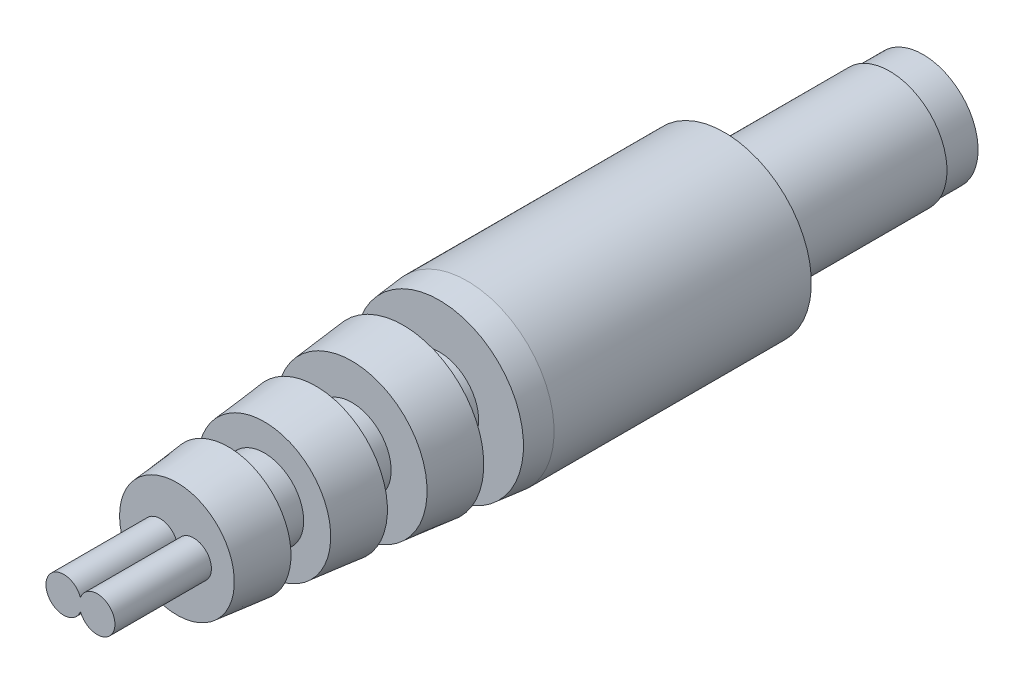
ISO-10303-21;
HEADER;
FILE_DESCRIPTION(('STEP AP214'),'2;1');
FILE_NAME('part.step','',(''),(''),'','','');
FILE_SCHEMA(('AUTOMOTIVE_DESIGN { 1 0 10303 214 1 1 1 1 }'));
ENDSEC;
DATA;
#1=APPLICATION_CONTEXT('core data for automotive mechanical design processes');
#2=APPLICATION_PROTOCOL_DEFINITION('international standard','automotive_design',2000,#1);
#3=PRODUCT_CONTEXT('',#1,'mechanical');
#4=PRODUCT('Part','Part','',(#3));
#5=PRODUCT_RELATED_PRODUCT_CATEGORY('part','',(#4));
#6=PRODUCT_DEFINITION_FORMATION('','',#4);
#7=PRODUCT_DEFINITION_CONTEXT('part definition',#1,'design');
#8=PRODUCT_DEFINITION('design','',#6,#7);
#9=PRODUCT_DEFINITION_SHAPE('','',#8);
#10=(LENGTH_UNIT() NAMED_UNIT(*) SI_UNIT(.MILLI.,.METRE.));
#11=(NAMED_UNIT(*) PLANE_ANGLE_UNIT() SI_UNIT($,.RADIAN.));
#12=(NAMED_UNIT(*) SI_UNIT($,.STERADIAN.) SOLID_ANGLE_UNIT());
#13=UNCERTAINTY_MEASURE_WITH_UNIT(LENGTH_MEASURE(1.E-05),#10,'distance_accuracy_value','');
#14=(GEOMETRIC_REPRESENTATION_CONTEXT(3) GLOBAL_UNCERTAINTY_ASSIGNED_CONTEXT((#13)) GLOBAL_UNIT_ASSIGNED_CONTEXT((#10,
#11,#12)) REPRESENTATION_CONTEXT('',''));
#15=CARTESIAN_POINT('',(0.,0.,0.));
#16=DIRECTION('',(0.,0.,1.));
#17=DIRECTION('',(1.,0.,0.));
#18=AXIS2_PLACEMENT_3D('',#15,#16,#17);
#19=CARTESIAN_POINT('',(0.,0.,36.83));
#20=DIRECTION('',(0.,0.,1.));
#21=DIRECTION('',(1.,0.,0.));
#22=AXIS2_PLACEMENT_3D('',#19,#20,#21);
#23=PLANE('',#22);
#24=CARTESIAN_POINT('',(0.,0.,36.83));
#25=DIRECTION('',(0.,0.,-1.));
#26=DIRECTION('',(-1.,0.,0.));
#27=AXIS2_PLACEMENT_3D('',#24,#25,#26);
#28=CIRCLE('',#27,2.8321);
#29=CARTESIAN_POINT('',(-2.8321,0.,36.83));
#30=VERTEX_POINT('',#29);
#31=EDGE_CURVE('E11',#30,#30,#28,.T.);
#32=ORIENTED_EDGE('',*,*,#31,.F.);
#33=EDGE_LOOP('',(#32));
#34=FACE_BOUND('',#33,.T.);
#35=CARTESIAN_POINT('',(0.826236930167257,0.,36.83));
#36=DIRECTION('',(0.,0.,1.));
#37=DIRECTION('',(1.,0.,0.));
#38=AXIS2_PLACEMENT_3D('',#35,#36,#37);
#39=CIRCLE('',#38,0.8763);
#40=CARTESIAN_POINT('',(0.,-0.291949011349221,36.83));
#41=VERTEX_POINT('',#40);
#42=CARTESIAN_POINT('',(0.,0.291949011349221,36.83));
#43=VERTEX_POINT('',#42);
#44=EDGE_CURVE('E62',#41,#43,#39,.T.);
#45=ORIENTED_EDGE('',*,*,#44,.F.);
#46=CARTESIAN_POINT('',(-0.826236930167257,0.,36.83));
#47=DIRECTION('',(0.,0.,1.));
#48=DIRECTION('',(-1.,0.,0.));
#49=AXIS2_PLACEMENT_3D('',#46,#47,#48);
#50=CIRCLE('',#49,0.8763);
#51=EDGE_CURVE('E47',#43,#41,#50,.T.);
#52=ORIENTED_EDGE('',*,*,#51,.F.);
#53=EDGE_LOOP('',(#45,#52));
#54=FACE_BOUND('',#53,.T.);
#55=ADVANCED_FACE('F33',(#34,#54),#23,.T.);
#56=CARTESIAN_POINT('',(0.,0.,34.29));
#57=DIRECTION('',(0.,0.,-1.));
#58=DIRECTION('',(-1.,0.,0.));
#59=AXIS2_PLACEMENT_3D('',#56,#57,#58);
#60=CONICAL_SURFACE('',#59,3.09105390070922,0.101599321439396);
#61=ORIENTED_EDGE('',*,*,#31,.T.);
#62=EDGE_LOOP('',(#61));
#63=FACE_BOUND('',#62,.T.);
#64=CARTESIAN_POINT('',(0.,0.,34.29));
#65=DIRECTION('',(0.,0.,-1.));
#66=DIRECTION('',(-1.,0.,0.));
#67=AXIS2_PLACEMENT_3D('',#64,#65,#66);
#68=CIRCLE('',#67,3.09105390070922);
#69=CARTESIAN_POINT('',(-3.09105390070922,0.,34.29));
#70=VERTEX_POINT('',#69);
#71=EDGE_CURVE('E40',#70,#70,#68,.T.);
#72=ORIENTED_EDGE('',*,*,#71,.F.);
#73=EDGE_LOOP('',(#72));
#74=FACE_BOUND('',#73,.T.);
#75=ADVANCED_FACE('F139',(#63,#74),#60,.T.);
#76=CARTESIAN_POINT('',(0.,3.09105390070922,34.29));
#77=DIRECTION('',(0.,0.,-1.));
#78=DIRECTION('',(-1.,0.,0.));
#79=AXIS2_PLACEMENT_3D('',#76,#77,#78);
#80=PLANE('',#79);
#81=ORIENTED_EDGE('',*,*,#71,.T.);
#82=EDGE_LOOP('',(#81));
#83=FACE_BOUND('',#82,.T.);
#84=CARTESIAN_POINT('',(0.,0.,34.29));
#85=DIRECTION('',(0.,0.,-1.));
#86=DIRECTION('',(-1.,0.,0.));
#87=AXIS2_PLACEMENT_3D('',#84,#85,#86);
#88=CIRCLE('',#87,1.93888495482852);
#89=CARTESIAN_POINT('',(-1.93888495482852,0.,34.29));
#90=VERTEX_POINT('',#89);
#91=EDGE_CURVE('E131',#90,#90,#88,.T.);
#92=ORIENTED_EDGE('',*,*,#91,.F.);
#93=EDGE_LOOP('',(#92));
#94=FACE_BOUND('',#93,.T.);
#95=ADVANCED_FACE('F136',(#83,#94),#80,.T.);
#96=CARTESIAN_POINT('',(0.,0.,0.));
#97=DIRECTION('',(0.,0.,-1.));
#98=DIRECTION('',(-1.,0.,0.));
#99=AXIS2_PLACEMENT_3D('',#96,#97,#98);
#100=CYLINDRICAL_SURFACE('',#99,1.93888495482852);
#101=ORIENTED_EDGE('',*,*,#91,.T.);
#102=EDGE_LOOP('',(#101));
#103=FACE_BOUND('',#102,.T.);
#104=CARTESIAN_POINT('',(0.,0.,32.512));
#105=DIRECTION('',(0.,0.,-1.));
#106=DIRECTION('',(-1.,0.,0.));
#107=AXIS2_PLACEMENT_3D('',#104,#105,#106);
#108=CIRCLE('',#107,1.93888495482852);
#109=CARTESIAN_POINT('',(-1.93888495482852,0.,32.512));
#110=VERTEX_POINT('',#109);
#111=EDGE_CURVE('E128',#110,#110,#108,.T.);
#112=ORIENTED_EDGE('',*,*,#111,.F.);
#113=EDGE_LOOP('',(#112));
#114=FACE_BOUND('',#113,.T.);
#115=ADVANCED_FACE('F146',(#103,#114),#100,.T.);
#116=CARTESIAN_POINT('',(0.,1.93888495482852,32.512));
#117=DIRECTION('',(0.,0.,1.));
#118=DIRECTION('',(1.,0.,0.));
#119=AXIS2_PLACEMENT_3D('',#116,#117,#118);
#120=PLANE('',#119);
#121=ORIENTED_EDGE('',*,*,#111,.T.);
#122=EDGE_LOOP('',(#121));
#123=FACE_BOUND('',#122,.T.);
#124=CARTESIAN_POINT('',(0.,0.,32.512));
#125=DIRECTION('',(0.,0.,-1.));
#126=DIRECTION('',(-1.,0.,0.));
#127=AXIS2_PLACEMENT_3D('',#124,#125,#126);
#128=CIRCLE('',#127,3.27232163120567);
#129=CARTESIAN_POINT('',(-3.27232163120567,0.,32.512));
#130=VERTEX_POINT('',#129);
#131=EDGE_CURVE('E125',#130,#130,#128,.T.);
#132=ORIENTED_EDGE('',*,*,#131,.F.);
#133=EDGE_LOOP('',(#132));
#134=FACE_BOUND('',#133,.T.);
#135=ADVANCED_FACE('F152',(#123,#134),#120,.T.);
#136=CARTESIAN_POINT('',(0.,0.,29.972));
#137=DIRECTION('',(0.,0.,-1.));
#138=DIRECTION('',(-1.,0.,0.));
#139=AXIS2_PLACEMENT_3D('',#136,#137,#138);
#140=CONICAL_SURFACE('',#139,3.53127553191489,0.101599321439396);
#141=ORIENTED_EDGE('',*,*,#131,.T.);
#142=EDGE_LOOP('',(#141));
#143=FACE_BOUND('',#142,.T.);
#144=CARTESIAN_POINT('',(0.,0.,29.972));
#145=DIRECTION('',(0.,0.,-1.));
#146=DIRECTION('',(-1.,0.,0.));
#147=AXIS2_PLACEMENT_3D('',#144,#145,#146);
#148=CIRCLE('',#147,3.53127553191489);
#149=CARTESIAN_POINT('',(-3.53127553191489,0.,29.972));
#150=VERTEX_POINT('',#149);
#151=EDGE_CURVE('E122',#150,#150,#148,.T.);
#152=ORIENTED_EDGE('',*,*,#151,.F.);
#153=EDGE_LOOP('',(#152));
#154=FACE_BOUND('',#153,.T.);
#155=ADVANCED_FACE('F156',(#143,#154),#140,.T.);
#156=CARTESIAN_POINT('',(0.,3.53127553191489,29.972));
#157=DIRECTION('',(0.,0.,-1.));
#158=DIRECTION('',(-1.,0.,0.));
#159=AXIS2_PLACEMENT_3D('',#156,#157,#158);
#160=PLANE('',#159);
#161=ORIENTED_EDGE('',*,*,#151,.T.);
#162=EDGE_LOOP('',(#161));
#163=FACE_BOUND('',#162,.T.);
#164=CARTESIAN_POINT('',(0.,0.,29.972));
#165=DIRECTION('',(0.,0.,-1.));
#166=DIRECTION('',(-1.,0.,0.));
#167=AXIS2_PLACEMENT_3D('',#164,#165,#166);
#168=CIRCLE('',#167,1.93888495482852);
#169=CARTESIAN_POINT('',(-1.93888495482852,0.,29.972));
#170=VERTEX_POINT('',#169);
#171=EDGE_CURVE('E119',#170,#170,#168,.T.);
#172=ORIENTED_EDGE('',*,*,#171,.F.);
#173=EDGE_LOOP('',(#172));
#174=FACE_BOUND('',#173,.T.);
#175=ADVANCED_FACE('F160',(#163,#174),#160,.T.);
#176=CARTESIAN_POINT('',(0.,0.,0.));
#177=DIRECTION('',(0.,0.,-1.));
#178=DIRECTION('',(-1.,0.,0.));
#179=AXIS2_PLACEMENT_3D('',#176,#177,#178);
#180=CYLINDRICAL_SURFACE('',#179,1.93888495482852);
#181=ORIENTED_EDGE('',*,*,#171,.T.);
#182=EDGE_LOOP('',(#181));
#183=FACE_BOUND('',#182,.T.);
#184=CARTESIAN_POINT('',(0.,0.,28.194));
#185=DIRECTION('',(0.,0.,-1.));
#186=DIRECTION('',(-1.,0.,0.));
#187=AXIS2_PLACEMENT_3D('',#184,#185,#186);
#188=CIRCLE('',#187,1.93888495482852);
#189=CARTESIAN_POINT('',(-1.93888495482852,0.,28.194));
#190=VERTEX_POINT('',#189);
#191=EDGE_CURVE('E116',#190,#190,#188,.T.);
#192=ORIENTED_EDGE('',*,*,#191,.F.);
#193=EDGE_LOOP('',(#192));
#194=FACE_BOUND('',#193,.T.);
#195=ADVANCED_FACE('F164',(#183,#194),#180,.T.);
#196=CARTESIAN_POINT('',(0.,1.93888495482852,28.194));
#197=DIRECTION('',(0.,0.,1.));
#198=DIRECTION('',(1.,0.,0.));
#199=AXIS2_PLACEMENT_3D('',#196,#197,#198);
#200=PLANE('',#199);
#201=ORIENTED_EDGE('',*,*,#191,.T.);
#202=EDGE_LOOP('',(#201));
#203=FACE_BOUND('',#202,.T.);
#204=CARTESIAN_POINT('',(0.,0.,28.194));
#205=DIRECTION('',(0.,0.,-1.));
#206=DIRECTION('',(-1.,0.,0.));
#207=AXIS2_PLACEMENT_3D('',#204,#205,#206);
#208=CIRCLE('',#207,3.71254326241135);
#209=CARTESIAN_POINT('',(-3.71254326241135,0.,28.194));
#210=VERTEX_POINT('',#209);
#211=EDGE_CURVE('E113',#210,#210,#208,.T.);
#212=ORIENTED_EDGE('',*,*,#211,.F.);
#213=EDGE_LOOP('',(#212));
#214=FACE_BOUND('',#213,.T.);
#215=ADVANCED_FACE('F168',(#203,#214),#200,.T.);
#216=CARTESIAN_POINT('',(0.,0.,25.654));
#217=DIRECTION('',(0.,0.,-1.));
#218=DIRECTION('',(-1.,0.,0.));
#219=AXIS2_PLACEMENT_3D('',#216,#217,#218);
#220=CONICAL_SURFACE('',#219,3.97149716312057,0.101599321439396);
#221=ORIENTED_EDGE('',*,*,#211,.T.);
#222=EDGE_LOOP('',(#221));
#223=FACE_BOUND('',#222,.T.);
#224=CARTESIAN_POINT('',(0.,0.,25.654));
#225=DIRECTION('',(0.,0.,-1.));
#226=DIRECTION('',(-1.,0.,0.));
#227=AXIS2_PLACEMENT_3D('',#224,#225,#226);
#228=CIRCLE('',#227,3.97149716312057);
#229=CARTESIAN_POINT('',(-3.97149716312057,0.,25.654));
#230=VERTEX_POINT('',#229);
#231=EDGE_CURVE('E110',#230,#230,#228,.T.);
#232=ORIENTED_EDGE('',*,*,#231,.F.);
#233=EDGE_LOOP('',(#232));
#234=FACE_BOUND('',#233,.T.);
#235=ADVANCED_FACE('F172',(#223,#234),#220,.T.);
#236=CARTESIAN_POINT('',(0.,3.97149716312057,25.654));
#237=DIRECTION('',(0.,0.,-1.));
#238=DIRECTION('',(-1.,0.,0.));
#239=AXIS2_PLACEMENT_3D('',#236,#237,#238);
#240=PLANE('',#239);
#241=ORIENTED_EDGE('',*,*,#231,.T.);
#242=EDGE_LOOP('',(#241));
#243=FACE_BOUND('',#242,.T.);
#244=CARTESIAN_POINT('',(0.,0.,25.654));
#245=DIRECTION('',(0.,0.,-1.));
#246=DIRECTION('',(-1.,0.,0.));
#247=AXIS2_PLACEMENT_3D('',#244,#245,#246);
#248=CIRCLE('',#247,1.93888495482852);
#249=CARTESIAN_POINT('',(-1.93888495482852,0.,25.654));
#250=VERTEX_POINT('',#249);
#251=EDGE_CURVE('E107',#250,#250,#248,.T.);
#252=ORIENTED_EDGE('',*,*,#251,.F.);
#253=EDGE_LOOP('',(#252));
#254=FACE_BOUND('',#253,.T.);
#255=ADVANCED_FACE('F176',(#243,#254),#240,.T.);
#256=CARTESIAN_POINT('',(0.,0.,0.));
#257=DIRECTION('',(0.,0.,-1.));
#258=DIRECTION('',(-1.,0.,0.));
#259=AXIS2_PLACEMENT_3D('',#256,#257,#258);
#260=CYLINDRICAL_SURFACE('',#259,1.93888495482852);
#261=ORIENTED_EDGE('',*,*,#251,.T.);
#262=EDGE_LOOP('',(#261));
#263=FACE_BOUND('',#262,.T.);
#264=CARTESIAN_POINT('',(0.,0.,23.876));
#265=DIRECTION('',(0.,0.,-1.));
#266=DIRECTION('',(-1.,0.,0.));
#267=AXIS2_PLACEMENT_3D('',#264,#265,#266);
#268=CIRCLE('',#267,1.93888495482852);
#269=CARTESIAN_POINT('',(-1.93888495482852,0.,23.876));
#270=VERTEX_POINT('',#269);
#271=EDGE_CURVE('E104',#270,#270,#268,.T.);
#272=ORIENTED_EDGE('',*,*,#271,.F.);
#273=EDGE_LOOP('',(#272));
#274=FACE_BOUND('',#273,.T.);
#275=ADVANCED_FACE('F180',(#263,#274),#260,.T.);
#276=CARTESIAN_POINT('',(0.,1.93888495482852,23.876));
#277=DIRECTION('',(0.,0.,1.));
#278=DIRECTION('',(1.,0.,0.));
#279=AXIS2_PLACEMENT_3D('',#276,#277,#278);
#280=PLANE('',#279);
#281=ORIENTED_EDGE('',*,*,#271,.T.);
#282=EDGE_LOOP('',(#281));
#283=FACE_BOUND('',#282,.T.);
#284=CARTESIAN_POINT('',(0.,0.,23.876));
#285=DIRECTION('',(0.,0.,-1.));
#286=DIRECTION('',(-1.,0.,0.));
#287=AXIS2_PLACEMENT_3D('',#284,#285,#286);
#288=CIRCLE('',#287,4.15276489361702);
#289=CARTESIAN_POINT('',(-4.15276489361702,0.,23.876));
#290=VERTEX_POINT('',#289);
#291=EDGE_CURVE('E101',#290,#290,#288,.T.);
#292=ORIENTED_EDGE('',*,*,#291,.F.);
#293=EDGE_LOOP('',(#292));
#294=FACE_BOUND('',#293,.T.);
#295=ADVANCED_FACE('F184',(#283,#294),#280,.T.);
#296=CARTESIAN_POINT('',(0.,0.,22.5044));
#297=DIRECTION('',(0.,0.,-1.));
#298=DIRECTION('',(-1.,0.,0.));
#299=AXIS2_PLACEMENT_3D('',#296,#297,#298);
#300=CONICAL_SURFACE('',#299,4.2926,0.101599321439396);
#301=ORIENTED_EDGE('',*,*,#291,.T.);
#302=EDGE_LOOP('',(#301));
#303=FACE_BOUND('',#302,.T.);
#304=CARTESIAN_POINT('',(0.,0.,22.5044));
#305=DIRECTION('',(0.,0.,-1.));
#306=DIRECTION('',(-1.,0.,0.));
#307=AXIS2_PLACEMENT_3D('',#304,#305,#306);
#308=CIRCLE('',#307,4.2926);
#309=CARTESIAN_POINT('',(-4.2926,0.,22.5044));
#310=VERTEX_POINT('',#309);
#311=EDGE_CURVE('E98',#310,#310,#308,.T.);
#312=ORIENTED_EDGE('',*,*,#311,.F.);
#313=EDGE_LOOP('',(#312));
#314=FACE_BOUND('',#313,.T.);
#315=ADVANCED_FACE('F188',(#303,#314),#300,.T.);
#316=CARTESIAN_POINT('',(0.,0.,0.));
#317=DIRECTION('',(0.,0.,-1.));
#318=DIRECTION('',(-1.,0.,0.));
#319=AXIS2_PLACEMENT_3D('',#316,#317,#318);
#320=CYLINDRICAL_SURFACE('',#319,4.2926);
#321=ORIENTED_EDGE('',*,*,#311,.T.);
#322=EDGE_LOOP('',(#321));
#323=FACE_BOUND('',#322,.T.);
#324=CARTESIAN_POINT('',(0.,0.,9.8044));
#325=DIRECTION('',(0.,0.,-1.));
#326=DIRECTION('',(-1.,0.,0.));
#327=AXIS2_PLACEMENT_3D('',#324,#325,#326);
#328=CIRCLE('',#327,4.2926);
#329=CARTESIAN_POINT('',(-4.2926,0.,9.8044));
#330=VERTEX_POINT('',#329);
#331=EDGE_CURVE('E95',#330,#330,#328,.T.);
#332=ORIENTED_EDGE('',*,*,#331,.F.);
#333=EDGE_LOOP('',(#332));
#334=FACE_BOUND('',#333,.T.);
#335=ADVANCED_FACE('F192',(#323,#334),#320,.T.);
#336=CARTESIAN_POINT('',(0.,2.8321,9.8044));
#337=DIRECTION('',(0.,0.,-1.));
#338=DIRECTION('',(-1.,0.,0.));
#339=AXIS2_PLACEMENT_3D('',#336,#337,#338);
#340=PLANE('',#339);
#341=ORIENTED_EDGE('',*,*,#331,.T.);
#342=EDGE_LOOP('',(#341));
#343=FACE_BOUND('',#342,.T.);
#344=CARTESIAN_POINT('',(0.,0.,9.8044));
#345=DIRECTION('',(0.,0.,-1.));
#346=DIRECTION('',(-1.,0.,0.));
#347=AXIS2_PLACEMENT_3D('',#344,#345,#346);
#348=CIRCLE('',#347,2.8321);
#349=CARTESIAN_POINT('',(-2.8321,0.,9.8044));
#350=VERTEX_POINT('',#349);
#351=EDGE_CURVE('E92',#350,#350,#348,.T.);
#352=ORIENTED_EDGE('',*,*,#351,.F.);
#353=EDGE_LOOP('',(#352));
#354=FACE_BOUND('',#353,.T.);
#355=ADVANCED_FACE('F196',(#343,#354),#340,.T.);
#356=CARTESIAN_POINT('',(0.,0.,0.));
#357=DIRECTION('',(0.,0.,-1.));
#358=DIRECTION('',(-1.,0.,0.));
#359=AXIS2_PLACEMENT_3D('',#356,#357,#358);
#360=CYLINDRICAL_SURFACE('',#359,2.8321);
#361=ORIENTED_EDGE('',*,*,#351,.T.);
#362=EDGE_LOOP('',(#361));
#363=FACE_BOUND('',#362,.T.);
#364=CARTESIAN_POINT('',(0.,0.,1.651));
#365=DIRECTION('',(0.,0.,-1.));
#366=DIRECTION('',(-1.,0.,0.));
#367=AXIS2_PLACEMENT_3D('',#364,#365,#366);
#368=CIRCLE('',#367,2.8321);
#369=CARTESIAN_POINT('',(-2.8321,0.,1.651));
#370=VERTEX_POINT('',#369);
#371=EDGE_CURVE('E89',#370,#370,#368,.T.);
#372=ORIENTED_EDGE('',*,*,#371,.F.);
#373=EDGE_LOOP('',(#372));
#374=FACE_BOUND('',#373,.T.);
#375=ADVANCED_FACE('F200',(#363,#374),#360,.T.);
#376=CARTESIAN_POINT('',(0.,2.8321,1.651));
#377=DIRECTION('',(0.,0.,-1.));
#378=DIRECTION('',(-1.,0.,0.));
#379=AXIS2_PLACEMENT_3D('',#376,#377,#378);
#380=PLANE('',#379);
#381=ORIENTED_EDGE('',*,*,#371,.T.);
#382=EDGE_LOOP('',(#381));
#383=FACE_BOUND('',#382,.T.);
#384=CARTESIAN_POINT('',(0.,0.,1.651));
#385=DIRECTION('',(0.,0.,-1.));
#386=DIRECTION('',(-1.,0.,0.));
#387=AXIS2_PLACEMENT_3D('',#384,#385,#386);
#388=CIRCLE('',#387,2.7178);
#389=CARTESIAN_POINT('',(-2.7178,0.,1.651));
#390=VERTEX_POINT('',#389);
#391=EDGE_CURVE('E86',#390,#390,#388,.T.);
#392=ORIENTED_EDGE('',*,*,#391,.F.);
#393=EDGE_LOOP('',(#392));
#394=FACE_BOUND('',#393,.T.);
#395=ADVANCED_FACE('F204',(#383,#394),#380,.T.);
#396=CARTESIAN_POINT('',(0.,0.,0.));
#397=DIRECTION('',(0.,0.,-1.));
#398=DIRECTION('',(-1.,0.,0.));
#399=AXIS2_PLACEMENT_3D('',#396,#397,#398);
#400=CYLINDRICAL_SURFACE('',#399,2.7178);
#401=ORIENTED_EDGE('',*,*,#391,.T.);
#402=EDGE_LOOP('',(#401));
#403=FACE_BOUND('',#402,.T.);
#404=CARTESIAN_POINT('',(0.,0.,0.));
#405=DIRECTION('',(0.,0.,-1.));
#406=DIRECTION('',(-1.,0.,0.));
#407=AXIS2_PLACEMENT_3D('',#404,#405,#406);
#408=CIRCLE('',#407,2.7178);
#409=CARTESIAN_POINT('',(-2.7178,0.,0.));
#410=VERTEX_POINT('',#409);
#411=EDGE_CURVE('E81',#410,#410,#408,.T.);
#412=ORIENTED_EDGE('',*,*,#411,.F.);
#413=EDGE_LOOP('',(#412));
#414=FACE_BOUND('',#413,.T.);
#415=ADVANCED_FACE('F208',(#403,#414),#400,.T.);
#416=CARTESIAN_POINT('',(0.,0.,0.));
#417=DIRECTION('',(0.,0.,-1.));
#418=DIRECTION('',(-1.,0.,0.));
#419=AXIS2_PLACEMENT_3D('',#416,#417,#418);
#420=PLANE('',#419);
#421=CARTESIAN_POINT('',(0.,0.,0.));
#422=DIRECTION('',(0.,0.,-1.));
#423=DIRECTION('',(-1.,0.,0.));
#424=AXIS2_PLACEMENT_3D('',#421,#422,#423);
#425=CIRCLE('',#424,1.1049);
#426=CARTESIAN_POINT('',(-1.1049,0.,0.));
#427=VERTEX_POINT('',#426);
#428=EDGE_CURVE('E77',#427,#427,#425,.T.);
#429=ORIENTED_EDGE('',*,*,#428,.F.);
#430=EDGE_LOOP('',(#429));
#431=FACE_BOUND('',#430,.T.);
#432=ORIENTED_EDGE('',*,*,#411,.T.);
#433=EDGE_LOOP('',(#432));
#434=FACE_BOUND('',#433,.T.);
#435=ADVANCED_FACE('F212',(#431,#434),#420,.T.);
#436=CARTESIAN_POINT('',(0.,0.,10.16));
#437=DIRECTION('',(0.,0.,-1.));
#438=DIRECTION('',(-1.,0.,0.));
#439=AXIS2_PLACEMENT_3D('',#436,#437,#438);
#440=CYLINDRICAL_SURFACE('',#439,1.1049);
#441=CARTESIAN_POINT('',(0.,0.,10.16));
#442=DIRECTION('',(0.,0.,-1.));
#443=DIRECTION('',(-1.,0.,0.));
#444=AXIS2_PLACEMENT_3D('',#441,#442,#443);
#445=CIRCLE('',#444,1.1049);
#446=CARTESIAN_POINT('',(-1.1049,0.,10.16));
#447=VERTEX_POINT('',#446);
#448=EDGE_CURVE('E78',#447,#447,#445,.T.);
#449=ORIENTED_EDGE('',*,*,#448,.F.);
#450=EDGE_LOOP('',(#449));
#451=FACE_BOUND('',#450,.T.);
#452=ORIENTED_EDGE('',*,*,#428,.T.);
#453=EDGE_LOOP('',(#452));
#454=FACE_BOUND('',#453,.T.);
#455=ADVANCED_FACE('F216',(#451,#454),#440,.F.);
#456=CARTESIAN_POINT('',(0.,0.,10.16));
#457=DIRECTION('',(0.,0.,-1.));
#458=DIRECTION('',(-1.,0.,0.));
#459=AXIS2_PLACEMENT_3D('',#456,#457,#458);
#460=PLANE('',#459);
#461=ORIENTED_EDGE('',*,*,#448,.T.);
#462=EDGE_LOOP('',(#461));
#463=FACE_BOUND('',#462,.T.);
#464=ADVANCED_FACE('F220',(#463),#460,.T.);
#465=CARTESIAN_POINT('',(-0.826236930167257,0.,41.5925));
#466=DIRECTION('',(0.,0.,-1.));
#467=DIRECTION('',(-1.,0.,0.));
#468=AXIS2_PLACEMENT_3D('',#465,#466,#467);
#469=CYLINDRICAL_SURFACE('',#468,0.8763);
#470=ORIENTED_EDGE('',*,*,#51,.T.);
#471=DIRECTION('',(0.,0.,-1.));
#472=VECTOR('',#471,1.);
#473=CARTESIAN_POINT('',(0.,-0.291949011349221,41.5925));
#474=LINE('',#473,#472);
#475=CARTESIAN_POINT('',(0.,-0.291949011349221,41.5925));
#476=VERTEX_POINT('',#475);
#477=EDGE_CURVE('E66',#476,#41,#474,.T.);
#478=ORIENTED_EDGE('',*,*,#477,.F.);
#479=CARTESIAN_POINT('',(-0.826236930167257,0.,41.5925));
#480=DIRECTION('',(0.,0.,1.));
#481=DIRECTION('',(-1.,0.,0.));
#482=AXIS2_PLACEMENT_3D('',#479,#480,#481);
#483=CIRCLE('',#482,0.8763);
#484=CARTESIAN_POINT('',(0.,0.291949011349221,41.5925));
#485=VERTEX_POINT('',#484);
#486=EDGE_CURVE('E68',#485,#476,#483,.T.);
#487=ORIENTED_EDGE('',*,*,#486,.F.);
#488=DIRECTION('',(0.,0.,-1.));
#489=VECTOR('',#488,1.);
#490=CARTESIAN_POINT('',(0.,0.291949011349221,41.5925));
#491=LINE('',#490,#489);
#492=EDGE_CURVE('E64',#485,#43,#491,.T.);
#493=ORIENTED_EDGE('',*,*,#492,.T.);
#494=EDGE_LOOP('',(#470,#478,#487,#493));
#495=FACE_BOUND('',#494,.T.);
#496=ADVANCED_FACE('F70',(#495),#469,.T.);
#497=CARTESIAN_POINT('',(0.826236930167257,0.,41.5925));
#498=DIRECTION('',(0.,0.,-1.));
#499=DIRECTION('',(-1.,0.,0.));
#500=AXIS2_PLACEMENT_3D('',#497,#498,#499);
#501=CYLINDRICAL_SURFACE('',#500,0.8763);
#502=ORIENTED_EDGE('',*,*,#44,.T.);
#503=ORIENTED_EDGE('',*,*,#492,.F.);
#504=CARTESIAN_POINT('',(0.826236930167257,0.,41.5925));
#505=DIRECTION('',(0.,0.,1.));
#506=DIRECTION('',(1.,0.,0.));
#507=AXIS2_PLACEMENT_3D('',#504,#505,#506);
#508=CIRCLE('',#507,0.8763);
#509=EDGE_CURVE('E55',#476,#485,#508,.T.);
#510=ORIENTED_EDGE('',*,*,#509,.F.);
#511=ORIENTED_EDGE('',*,*,#477,.T.);
#512=EDGE_LOOP('',(#502,#503,#510,#511));
#513=FACE_BOUND('',#512,.T.);
#514=ADVANCED_FACE('F63',(#513),#501,.T.);
#515=CARTESIAN_POINT('',(0.,0.,41.5925));
#516=DIRECTION('',(0.,0.,-1.));
#517=DIRECTION('',(-1.,0.,0.));
#518=AXIS2_PLACEMENT_3D('',#515,#516,#517);
#519=PLANE('',#518);
#520=ORIENTED_EDGE('',*,*,#486,.T.);
#521=ORIENTED_EDGE('',*,*,#509,.T.);
#522=EDGE_LOOP('',(#520,#521));
#523=FACE_BOUND('',#522,.T.);
#524=ADVANCED_FACE('F229',(#523),#519,.F.);
#525=CLOSED_SHELL('',(#55,#75,#95,#115,#135,#155,#175,#195,#215,#235,#255,#275,#295,#315,#335,
#355,#375,#395,#415,#435,#455,#464,#496,#514,#524));
#526=MANIFOLD_SOLID_BREP('B2',#525);
#527=ADVANCED_BREP_SHAPE_REPRESENTATION('',(#18,#526),#14);
#528=SHAPE_DEFINITION_REPRESENTATION(#9,#527);
ENDSEC;
END-ISO-10303-21;
